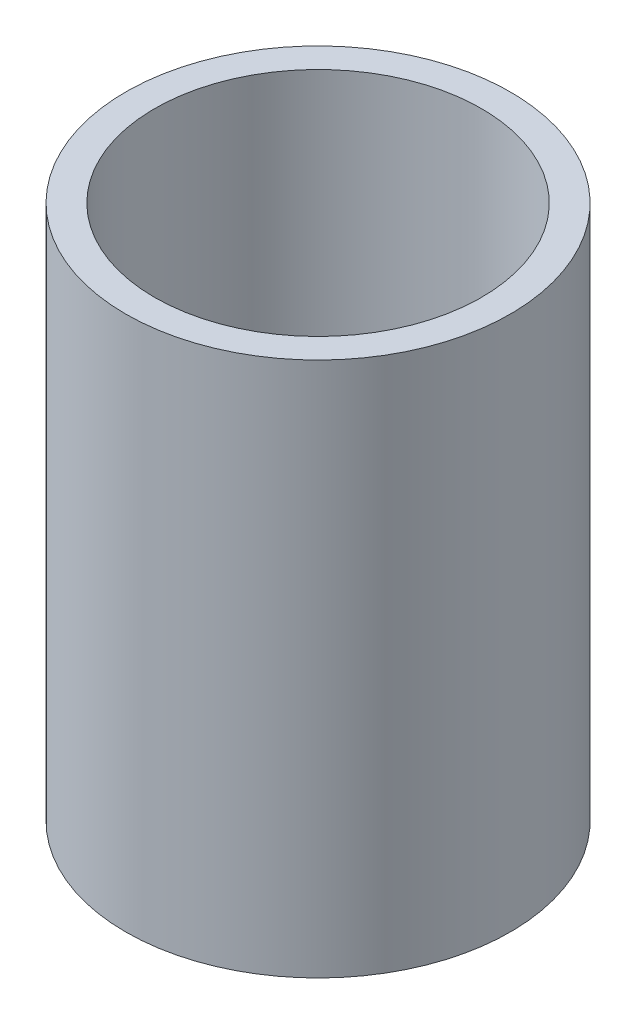
ISO-10303-21;
HEADER;
FILE_DESCRIPTION(('STEP AP214'),'2;1');
FILE_NAME('part.step','',(''),(''),'','','');
FILE_SCHEMA(('AUTOMOTIVE_DESIGN { 1 0 10303 214 1 1 1 1 }'));
ENDSEC;
DATA;
#1=APPLICATION_CONTEXT('core data for automotive mechanical design processes');
#2=APPLICATION_PROTOCOL_DEFINITION('international standard','automotive_design',2000,#1);
#3=PRODUCT_CONTEXT('',#1,'mechanical');
#4=PRODUCT('Part','Part','',(#3));
#5=PRODUCT_RELATED_PRODUCT_CATEGORY('part','',(#4));
#6=PRODUCT_DEFINITION_FORMATION('','',#4);
#7=PRODUCT_DEFINITION_CONTEXT('part definition',#1,'design');
#8=PRODUCT_DEFINITION('design','',#6,#7);
#9=PRODUCT_DEFINITION_SHAPE('','',#8);
#10=(LENGTH_UNIT() NAMED_UNIT(*) SI_UNIT(.MILLI.,.METRE.));
#11=(NAMED_UNIT(*) PLANE_ANGLE_UNIT() SI_UNIT($,.RADIAN.));
#12=(NAMED_UNIT(*) SI_UNIT($,.STERADIAN.) SOLID_ANGLE_UNIT());
#13=UNCERTAINTY_MEASURE_WITH_UNIT(LENGTH_MEASURE(1.E-05),#10,'distance_accuracy_value','');
#14=(GEOMETRIC_REPRESENTATION_CONTEXT(3) GLOBAL_UNCERTAINTY_ASSIGNED_CONTEXT((#13)) GLOBAL_UNIT_ASSIGNED_CONTEXT((#10,
#11,#12)) REPRESENTATION_CONTEXT('',''));
#15=CARTESIAN_POINT('',(0.,0.,0.));
#16=DIRECTION('',(0.,0.,1.));
#17=DIRECTION('',(1.,0.,0.));
#18=AXIS2_PLACEMENT_3D('',#15,#16,#17);
#19=CARTESIAN_POINT('',(0.,-83.46,0.));
#20=DIRECTION('',(0.,1.,0.));
#21=DIRECTION('',(0.,0.,1.));
#22=AXIS2_PLACEMENT_3D('',#19,#20,#21);
#23=CYLINDRICAL_SURFACE('',#22,30.);
#24=CARTESIAN_POINT('',(0.,-83.46,0.));
#25=DIRECTION('',(0.,1.,0.));
#26=DIRECTION('',(0.,0.,1.));
#27=AXIS2_PLACEMENT_3D('',#24,#25,#26);
#28=CIRCLE('',#27,30.);
#29=CARTESIAN_POINT('',(0.,-83.46,30.));
#30=VERTEX_POINT('',#29);
#31=EDGE_CURVE('E10',#30,#30,#28,.T.);
#32=ORIENTED_EDGE('',*,*,#31,.T.);
#33=EDGE_LOOP('',(#32));
#34=FACE_BOUND('',#33,.T.);
#35=CARTESIAN_POINT('',(0.,0.,0.));
#36=DIRECTION('',(0.,1.,0.));
#37=DIRECTION('',(0.,0.,1.));
#38=AXIS2_PLACEMENT_3D('',#35,#36,#37);
#39=CIRCLE('',#38,30.);
#40=CARTESIAN_POINT('',(0.,0.,30.));
#41=VERTEX_POINT('',#40);
#42=EDGE_CURVE('E36',#41,#41,#39,.T.);
#43=ORIENTED_EDGE('',*,*,#42,.F.);
#44=EDGE_LOOP('',(#43));
#45=FACE_BOUND('',#44,.T.);
#46=ADVANCED_FACE('F33',(#34,#45),#23,.T.);
#47=CARTESIAN_POINT('',(0.,-83.46,0.));
#48=DIRECTION('',(0.,1.,0.));
#49=DIRECTION('',(0.,0.,1.));
#50=AXIS2_PLACEMENT_3D('',#47,#48,#49);
#51=PLANE('',#50);
#52=CARTESIAN_POINT('',(0.,-83.46,0.));
#53=DIRECTION('',(0.,1.,0.));
#54=DIRECTION('',(0.,0.,1.));
#55=AXIS2_PLACEMENT_3D('',#52,#53,#54);
#56=CIRCLE('',#55,25.5);
#57=CARTESIAN_POINT('',(0.,-83.46,25.5));
#58=VERTEX_POINT('',#57);
#59=EDGE_CURVE('E43',#58,#58,#56,.T.);
#60=ORIENTED_EDGE('',*,*,#59,.T.);
#61=EDGE_LOOP('',(#60));
#62=FACE_BOUND('',#61,.T.);
#63=ORIENTED_EDGE('',*,*,#31,.F.);
#64=EDGE_LOOP('',(#63));
#65=FACE_BOUND('',#64,.T.);
#66=ADVANCED_FACE('F51',(#62,#65),#51,.F.);
#67=CARTESIAN_POINT('',(0.,0.,0.));
#68=DIRECTION('',(0.,1.,0.));
#69=DIRECTION('',(0.,0.,1.));
#70=AXIS2_PLACEMENT_3D('',#67,#68,#69);
#71=PLANE('',#70);
#72=CARTESIAN_POINT('',(0.,0.,0.));
#73=DIRECTION('',(0.,1.,0.));
#74=DIRECTION('',(0.,0.,1.));
#75=AXIS2_PLACEMENT_3D('',#72,#73,#74);
#76=CIRCLE('',#75,25.5);
#77=CARTESIAN_POINT('',(0.,0.,25.5));
#78=VERTEX_POINT('',#77);
#79=EDGE_CURVE('E45',#78,#78,#76,.T.);
#80=ORIENTED_EDGE('',*,*,#79,.F.);
#81=EDGE_LOOP('',(#80));
#82=FACE_BOUND('',#81,.T.);
#83=ORIENTED_EDGE('',*,*,#42,.T.);
#84=EDGE_LOOP('',(#83));
#85=FACE_BOUND('',#84,.T.);
#86=ADVANCED_FACE('F57',(#82,#85),#71,.T.);
#87=CARTESIAN_POINT('',(0.,-83.46,0.));
#88=DIRECTION('',(0.,1.,0.));
#89=DIRECTION('',(0.,0.,1.));
#90=AXIS2_PLACEMENT_3D('',#87,#88,#89);
#91=CYLINDRICAL_SURFACE('',#90,25.5);
#92=ORIENTED_EDGE('',*,*,#59,.F.);
#93=EDGE_LOOP('',(#92));
#94=FACE_BOUND('',#93,.T.);
#95=ORIENTED_EDGE('',*,*,#79,.T.);
#96=EDGE_LOOP('',(#95));
#97=FACE_BOUND('',#96,.T.);
#98=ADVANCED_FACE('F54',(#94,#97),#91,.F.);
#99=CLOSED_SHELL('',(#46,#66,#86,#98));
#100=MANIFOLD_SOLID_BREP('B2',#99);
#101=ADVANCED_BREP_SHAPE_REPRESENTATION('',(#18,#100),#14);
#102=SHAPE_DEFINITION_REPRESENTATION(#9,#101);
ENDSEC;
END-ISO-10303-21;
